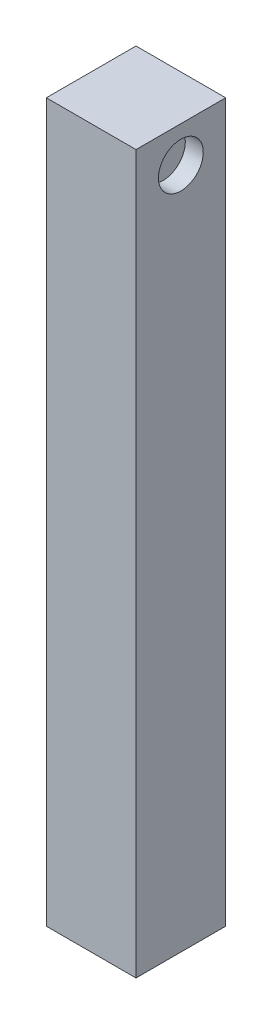
ISO-10303-21;
HEADER;
FILE_DESCRIPTION(('STEP AP214'),'2;1');
FILE_NAME('part.step','',(''),(''),'','','');
FILE_SCHEMA(('AUTOMOTIVE_DESIGN { 1 0 10303 214 1 1 1 1 }'));
ENDSEC;
DATA;
#1=APPLICATION_CONTEXT('core data for automotive mechanical design processes');
#2=APPLICATION_PROTOCOL_DEFINITION('international standard','automotive_design',2000,#1);
#3=PRODUCT_CONTEXT('',#1,'mechanical');
#4=PRODUCT('Part','Part','',(#3));
#5=PRODUCT_RELATED_PRODUCT_CATEGORY('part','',(#4));
#6=PRODUCT_DEFINITION_FORMATION('','',#4);
#7=PRODUCT_DEFINITION_CONTEXT('part definition',#1,'design');
#8=PRODUCT_DEFINITION('design','',#6,#7);
#9=PRODUCT_DEFINITION_SHAPE('','',#8);
#10=(LENGTH_UNIT() NAMED_UNIT(*) SI_UNIT(.MILLI.,.METRE.));
#11=(NAMED_UNIT(*) PLANE_ANGLE_UNIT() SI_UNIT($,.RADIAN.));
#12=(NAMED_UNIT(*) SI_UNIT($,.STERADIAN.) SOLID_ANGLE_UNIT());
#13=UNCERTAINTY_MEASURE_WITH_UNIT(LENGTH_MEASURE(1.E-05),#10,'distance_accuracy_value','');
#14=(GEOMETRIC_REPRESENTATION_CONTEXT(3) GLOBAL_UNCERTAINTY_ASSIGNED_CONTEXT((#13)) GLOBAL_UNIT_ASSIGNED_CONTEXT((#10,
#11,#12)) REPRESENTATION_CONTEXT('',''));
#15=CARTESIAN_POINT('',(0.,0.,0.));
#16=DIRECTION('',(0.,0.,1.));
#17=DIRECTION('',(1.,0.,0.));
#18=AXIS2_PLACEMENT_3D('',#15,#16,#17);
#19=CARTESIAN_POINT('',(50.,-400.,-50.));
#20=DIRECTION('',(0.,0.,1.));
#21=DIRECTION('',(1.,0.,0.));
#22=AXIS2_PLACEMENT_3D('',#19,#20,#21);
#23=PLANE('',#22);
#24=DIRECTION('',(0.,1.,0.));
#25=VECTOR('',#24,1.);
#26=CARTESIAN_POINT('',(-50.,-400.,-50.));
#27=LINE('',#26,#25);
#28=CARTESIAN_POINT('',(-50.,-400.,-50.));
#29=VERTEX_POINT('',#28);
#30=CARTESIAN_POINT('',(-50.,400.,-50.));
#31=VERTEX_POINT('',#30);
#32=EDGE_CURVE('E107',#29,#31,#27,.T.);
#33=ORIENTED_EDGE('',*,*,#32,.T.);
#34=DIRECTION('',(-1.,0.,0.));
#35=VECTOR('',#34,1.);
#36=CARTESIAN_POINT('',(50.,400.,-50.));
#37=LINE('',#36,#35);
#38=CARTESIAN_POINT('',(50.,400.,-50.));
#39=VERTEX_POINT('',#38);
#40=EDGE_CURVE('E11',#39,#31,#37,.T.);
#41=ORIENTED_EDGE('',*,*,#40,.F.);
#42=DIRECTION('',(0.,1.,0.));
#43=VECTOR('',#42,1.);
#44=CARTESIAN_POINT('',(50.,-400.,-50.));
#45=LINE('',#44,#43);
#46=CARTESIAN_POINT('',(50.,-400.,-50.));
#47=VERTEX_POINT('',#46);
#48=EDGE_CURVE('E91',#47,#39,#45,.T.);
#49=ORIENTED_EDGE('',*,*,#48,.F.);
#50=DIRECTION('',(-1.,0.,0.));
#51=VECTOR('',#50,1.);
#52=CARTESIAN_POINT('',(50.,-400.,-50.));
#53=LINE('',#52,#51);
#54=EDGE_CURVE('E103',#47,#29,#53,.T.);
#55=ORIENTED_EDGE('',*,*,#54,.T.);
#56=EDGE_LOOP('',(#33,#41,#49,#55));
#57=FACE_BOUND('',#56,.T.);
#58=ADVANCED_FACE('F39',(#57),#23,.F.);
#59=CARTESIAN_POINT('',(50.,400.,50.));
#60=DIRECTION('',(0.,-1.,0.));
#61=DIRECTION('',(0.,0.,-1.));
#62=AXIS2_PLACEMENT_3D('',#59,#60,#61);
#63=PLANE('',#62);
#64=DIRECTION('',(0.,0.,1.));
#65=VECTOR('',#64,1.);
#66=CARTESIAN_POINT('',(-50.,400.,50.));
#67=LINE('',#66,#65);
#68=CARTESIAN_POINT('',(-50.,400.,50.));
#69=VERTEX_POINT('',#68);
#70=EDGE_CURVE('E96',#31,#69,#67,.T.);
#71=ORIENTED_EDGE('',*,*,#70,.T.);
#72=DIRECTION('',(-1.,0.,0.));
#73=VECTOR('',#72,1.);
#74=CARTESIAN_POINT('',(50.,400.,50.));
#75=LINE('',#74,#73);
#76=CARTESIAN_POINT('',(50.,400.,50.));
#77=VERTEX_POINT('',#76);
#78=EDGE_CURVE('E48',#77,#69,#75,.T.);
#79=ORIENTED_EDGE('',*,*,#78,.F.);
#80=DIRECTION('',(0.,0.,1.));
#81=VECTOR('',#80,1.);
#82=CARTESIAN_POINT('',(50.,400.,50.));
#83=LINE('',#82,#81);
#84=EDGE_CURVE('E86',#39,#77,#83,.T.);
#85=ORIENTED_EDGE('',*,*,#84,.F.);
#86=ORIENTED_EDGE('',*,*,#40,.T.);
#87=EDGE_LOOP('',(#71,#79,#85,#86));
#88=FACE_BOUND('',#87,.T.);
#89=ADVANCED_FACE('F95',(#88),#63,.F.);
#90=CARTESIAN_POINT('',(50.,-400.,50.));
#91=DIRECTION('',(0.,0.,-1.));
#92=DIRECTION('',(-1.,0.,0.));
#93=AXIS2_PLACEMENT_3D('',#90,#91,#92);
#94=PLANE('',#93);
#95=DIRECTION('',(0.,-1.,0.));
#96=VECTOR('',#95,1.);
#97=CARTESIAN_POINT('',(-50.,-400.,50.));
#98=LINE('',#97,#96);
#99=CARTESIAN_POINT('',(-50.,-400.,50.));
#100=VERTEX_POINT('',#99);
#101=EDGE_CURVE('E73',#69,#100,#98,.T.);
#102=ORIENTED_EDGE('',*,*,#101,.T.);
#103=DIRECTION('',(-1.,0.,0.));
#104=VECTOR('',#103,1.);
#105=CARTESIAN_POINT('',(50.,-400.,50.));
#106=LINE('',#105,#104);
#107=CARTESIAN_POINT('',(50.,-400.,50.));
#108=VERTEX_POINT('',#107);
#109=EDGE_CURVE('E98',#108,#100,#106,.T.);
#110=ORIENTED_EDGE('',*,*,#109,.F.);
#111=DIRECTION('',(0.,-1.,0.));
#112=VECTOR('',#111,1.);
#113=CARTESIAN_POINT('',(50.,-400.,50.));
#114=LINE('',#113,#112);
#115=EDGE_CURVE('E89',#77,#108,#114,.T.);
#116=ORIENTED_EDGE('',*,*,#115,.F.);
#117=ORIENTED_EDGE('',*,*,#78,.T.);
#118=EDGE_LOOP('',(#102,#110,#116,#117));
#119=FACE_BOUND('',#118,.T.);
#120=ADVANCED_FACE('F99',(#119),#94,.F.);
#121=CARTESIAN_POINT('',(50.,-400.,50.));
#122=DIRECTION('',(0.,1.,0.));
#123=DIRECTION('',(0.,0.,1.));
#124=AXIS2_PLACEMENT_3D('',#121,#122,#123);
#125=PLANE('',#124);
#126=DIRECTION('',(0.,0.,-1.));
#127=VECTOR('',#126,1.);
#128=CARTESIAN_POINT('',(-50.,-400.,50.));
#129=LINE('',#128,#127);
#130=EDGE_CURVE('E79',#100,#29,#129,.T.);
#131=ORIENTED_EDGE('',*,*,#130,.T.);
#132=ORIENTED_EDGE('',*,*,#54,.F.);
#133=DIRECTION('',(0.,0.,-1.));
#134=VECTOR('',#133,1.);
#135=CARTESIAN_POINT('',(50.,-400.,50.));
#136=LINE('',#135,#134);
#137=EDGE_CURVE('E56',#108,#47,#136,.T.);
#138=ORIENTED_EDGE('',*,*,#137,.F.);
#139=ORIENTED_EDGE('',*,*,#109,.T.);
#140=EDGE_LOOP('',(#131,#132,#138,#139));
#141=FACE_BOUND('',#140,.T.);
#142=ADVANCED_FACE('F121',(#141),#125,.F.);
#143=CARTESIAN_POINT('',(50.,0.,0.));
#144=DIRECTION('',(-1.,0.,0.));
#145=DIRECTION('',(0.,0.,1.));
#146=AXIS2_PLACEMENT_3D('',#143,#144,#145);
#147=PLANE('',#146);
#148=CARTESIAN_POINT('',(50.,360.,0.));
#149=DIRECTION('',(1.,0.,0.));
#150=DIRECTION('',(0.,0.,-1.));
#151=AXIS2_PLACEMENT_3D('',#148,#149,#150);
#152=CIRCLE('',#151,25.);
#153=CARTESIAN_POINT('',(50.,360.,-25.0000000000001));
#154=VERTEX_POINT('',#153);
#155=EDGE_CURVE('E128',#154,#154,#152,.T.);
#156=ORIENTED_EDGE('',*,*,#155,.F.);
#157=EDGE_LOOP('',(#156));
#158=FACE_BOUND('',#157,.T.);
#159=ORIENTED_EDGE('',*,*,#48,.T.);
#160=ORIENTED_EDGE('',*,*,#84,.T.);
#161=ORIENTED_EDGE('',*,*,#115,.T.);
#162=ORIENTED_EDGE('',*,*,#137,.T.);
#163=EDGE_LOOP('',(#159,#160,#161,#162));
#164=FACE_BOUND('',#163,.T.);
#165=ADVANCED_FACE('F87',(#158,#164),#147,.F.);
#166=CARTESIAN_POINT('',(-50.,0.,0.));
#167=DIRECTION('',(-1.,0.,0.));
#168=DIRECTION('',(0.,0.,1.));
#169=AXIS2_PLACEMENT_3D('',#166,#167,#168);
#170=PLANE('',#169);
#171=ORIENTED_EDGE('',*,*,#32,.F.);
#172=ORIENTED_EDGE('',*,*,#130,.F.);
#173=ORIENTED_EDGE('',*,*,#101,.F.);
#174=ORIENTED_EDGE('',*,*,#70,.F.);
#175=EDGE_LOOP('',(#171,#172,#173,#174));
#176=FACE_BOUND('',#175,.T.);
#177=ADVANCED_FACE('F124',(#176),#170,.T.);
#178=CARTESIAN_POINT('',(30.,360.,0.));
#179=DIRECTION('',(1.,0.,0.));
#180=DIRECTION('',(0.,0.,-1.));
#181=AXIS2_PLACEMENT_3D('',#178,#179,#180);
#182=CYLINDRICAL_SURFACE('',#181,25.);
#183=CARTESIAN_POINT('',(30.,360.,0.));
#184=DIRECTION('',(1.,0.,0.));
#185=DIRECTION('',(0.,0.,-1.));
#186=AXIS2_PLACEMENT_3D('',#183,#184,#185);
#187=CIRCLE('',#186,25.);
#188=CARTESIAN_POINT('',(30.,360.,-25.0000000000001));
#189=VERTEX_POINT('',#188);
#190=EDGE_CURVE('E111',#189,#189,#187,.T.);
#191=ORIENTED_EDGE('',*,*,#190,.F.);
#192=EDGE_LOOP('',(#191));
#193=FACE_BOUND('',#192,.T.);
#194=ORIENTED_EDGE('',*,*,#155,.T.);
#195=EDGE_LOOP('',(#194));
#196=FACE_BOUND('',#195,.T.);
#197=ADVANCED_FACE('F138',(#193,#196),#182,.F.);
#198=CARTESIAN_POINT('',(30.,360.,0.));
#199=DIRECTION('',(1.,0.,0.));
#200=DIRECTION('',(0.,0.,-1.));
#201=AXIS2_PLACEMENT_3D('',#198,#199,#200);
#202=PLANE('',#201);
#203=ORIENTED_EDGE('',*,*,#190,.T.);
#204=EDGE_LOOP('',(#203));
#205=FACE_BOUND('',#204,.T.);
#206=ADVANCED_FACE('F136',(#205),#202,.T.);
#207=CLOSED_SHELL('',(#58,#89,#120,#142,#165,#177,#197,#206));
#208=MANIFOLD_SOLID_BREP('B2',#207);
#209=ADVANCED_BREP_SHAPE_REPRESENTATION('',(#18,#208),#14);
#210=SHAPE_DEFINITION_REPRESENTATION(#9,#209);
ENDSEC;
END-ISO-10303-21;
